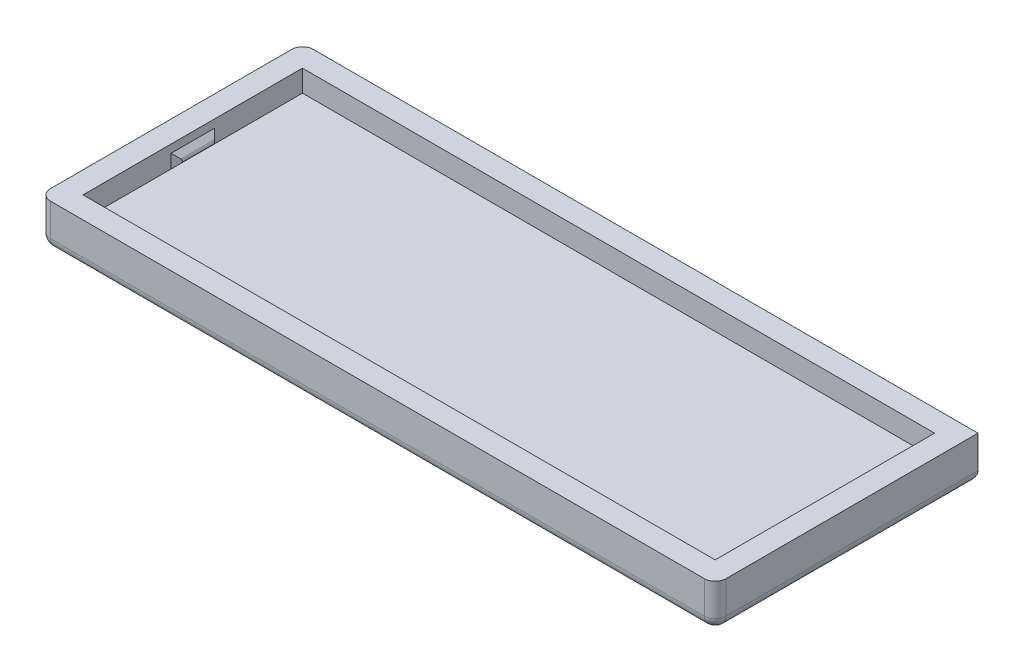
ISO-10303-21;
HEADER;
FILE_DESCRIPTION(('STEP AP214'),'2;1');
FILE_NAME('part.step','',(''),(''),'','','');
FILE_SCHEMA(('AUTOMOTIVE_DESIGN { 1 0 10303 214 1 1 1 1 }'));
ENDSEC;
DATA;
#1=APPLICATION_CONTEXT('core data for automotive mechanical design processes');
#2=APPLICATION_PROTOCOL_DEFINITION('international standard','automotive_design',2000,#1);
#3=PRODUCT_CONTEXT('',#1,'mechanical');
#4=PRODUCT('Part','Part','',(#3));
#5=PRODUCT_RELATED_PRODUCT_CATEGORY('part','',(#4));
#6=PRODUCT_DEFINITION_FORMATION('','',#4);
#7=PRODUCT_DEFINITION_CONTEXT('part definition',#1,'design');
#8=PRODUCT_DEFINITION('design','',#6,#7);
#9=PRODUCT_DEFINITION_SHAPE('','',#8);
#10=(LENGTH_UNIT() NAMED_UNIT(*) SI_UNIT(.MILLI.,.METRE.));
#11=(NAMED_UNIT(*) PLANE_ANGLE_UNIT() SI_UNIT($,.RADIAN.));
#12=(NAMED_UNIT(*) SI_UNIT($,.STERADIAN.) SOLID_ANGLE_UNIT());
#13=UNCERTAINTY_MEASURE_WITH_UNIT(LENGTH_MEASURE(1.E-05),#10,'distance_accuracy_value','');
#14=(GEOMETRIC_REPRESENTATION_CONTEXT(3) GLOBAL_UNCERTAINTY_ASSIGNED_CONTEXT((#13)) GLOBAL_UNIT_ASSIGNED_CONTEXT((#10,
#11,#12)) REPRESENTATION_CONTEXT('',''));
#15=CARTESIAN_POINT('',(0.,0.,0.));
#16=DIRECTION('',(0.,0.,1.));
#17=DIRECTION('',(1.,0.,0.));
#18=AXIS2_PLACEMENT_3D('',#15,#16,#17);
#19=CARTESIAN_POINT('',(-46.301,6.35,16.075));
#20=DIRECTION('',(1.,0.,0.));
#21=DIRECTION('',(0.,0.,-1.));
#22=AXIS2_PLACEMENT_3D('',#19,#20,#21);
#23=PLANE('',#22);
#24=DIRECTION('',(0.,0.,1.));
#25=VECTOR('',#24,1.);
#26=CARTESIAN_POINT('',(-46.301,3.175,16.075));
#27=LINE('',#26,#25);
#28=CARTESIAN_POINT('',(-46.301,3.175,3.175));
#29=VERTEX_POINT('',#28);
#30=CARTESIAN_POINT('',(-46.301,3.175,16.075));
#31=VERTEX_POINT('',#30);
#32=EDGE_CURVE('E283',#29,#31,#27,.T.);
#33=ORIENTED_EDGE('',*,*,#32,.F.);
#34=DIRECTION('',(0.,-1.,0.));
#35=VECTOR('',#34,1.);
#36=CARTESIAN_POINT('',(-46.301,3.175,3.175));
#37=LINE('',#36,#35);
#38=CARTESIAN_POINT('',(-46.301,5.175,3.175));
#39=VERTEX_POINT('',#38);
#40=EDGE_CURVE('E199',#39,#29,#37,.T.);
#41=ORIENTED_EDGE('',*,*,#40,.F.);
#42=DIRECTION('',(0.,0.,1.));
#43=VECTOR('',#42,1.);
#44=CARTESIAN_POINT('',(-46.301,5.175,3.175));
#45=LINE('',#44,#43);
#46=CARTESIAN_POINT('',(-46.301,5.175,-3.175));
#47=VERTEX_POINT('',#46);
#48=EDGE_CURVE('E244',#47,#39,#45,.T.);
#49=ORIENTED_EDGE('',*,*,#48,.F.);
#50=DIRECTION('',(0.,1.,0.));
#51=VECTOR('',#50,1.);
#52=CARTESIAN_POINT('',(-46.301,3.175,-3.175));
#53=LINE('',#52,#51);
#54=CARTESIAN_POINT('',(-46.301,3.175,-3.175));
#55=VERTEX_POINT('',#54);
#56=EDGE_CURVE('E240',#55,#47,#53,.T.);
#57=ORIENTED_EDGE('',*,*,#56,.F.);
#58=CARTESIAN_POINT('',(-46.301,3.175,-16.075));
#59=VERTEX_POINT('',#58);
#60=EDGE_CURVE('E284',#59,#55,#27,.T.);
#61=ORIENTED_EDGE('',*,*,#60,.F.);
#62=DIRECTION('',(0.,-1.,0.));
#63=VECTOR('',#62,1.);
#64=CARTESIAN_POINT('',(-46.301,6.35,-16.075));
#65=LINE('',#64,#63);
#66=CARTESIAN_POINT('',(-46.301,6.35,-16.075));
#67=VERTEX_POINT('',#66);
#68=EDGE_CURVE('E297',#67,#59,#65,.T.);
#69=ORIENTED_EDGE('',*,*,#68,.F.);
#70=DIRECTION('',(0.,0.,1.));
#71=VECTOR('',#70,1.);
#72=CARTESIAN_POINT('',(-46.301,6.35,16.075));
#73=LINE('',#72,#71);
#74=CARTESIAN_POINT('',(-46.301,6.35,16.075));
#75=VERTEX_POINT('',#74);
#76=EDGE_CURVE('E268',#67,#75,#73,.T.);
#77=ORIENTED_EDGE('',*,*,#76,.T.);
#78=DIRECTION('',(0.,-1.,0.));
#79=VECTOR('',#78,1.);
#80=CARTESIAN_POINT('',(-46.301,6.35,16.075));
#81=LINE('',#80,#79);
#82=EDGE_CURVE('E293',#75,#31,#81,.T.);
#83=ORIENTED_EDGE('',*,*,#82,.T.);
#84=EDGE_LOOP('',(#33,#41,#49,#57,#61,#69,#77,#83));
#85=FACE_BOUND('',#84,.T.);
#86=ADVANCED_FACE('F43',(#85),#23,.T.);
#87=CARTESIAN_POINT('',(49.476,3.175,19.25));
#88=DIRECTION('',(-1.,0.,0.));
#89=DIRECTION('',(0.,0.,1.));
#90=AXIS2_PLACEMENT_3D('',#87,#88,#89);
#91=PLANE('',#90);
#92=DIRECTION('',(0.,-1.,0.));
#93=VECTOR('',#92,1.);
#94=CARTESIAN_POINT('',(49.476,3.175,17.6625));
#95=LINE('',#94,#93);
#96=CARTESIAN_POINT('',(49.476,6.35,17.6625));
#97=VERTEX_POINT('',#96);
#98=CARTESIAN_POINT('',(49.476,1.5875,17.6625));
#99=VERTEX_POINT('',#98);
#100=EDGE_CURVE('E376',#97,#99,#95,.T.);
#101=ORIENTED_EDGE('',*,*,#100,.T.);
#102=DIRECTION('',(0.,0.,-1.));
#103=VECTOR('',#102,1.);
#104=CARTESIAN_POINT('',(49.476,1.5875,-19.25));
#105=LINE('',#104,#103);
#106=CARTESIAN_POINT('',(49.476,1.5875,-19.25));
#107=VERTEX_POINT('',#106);
#108=EDGE_CURVE('E379',#99,#107,#105,.T.);
#109=ORIENTED_EDGE('',*,*,#108,.T.);
#110=DIRECTION('',(0.,-1.,0.));
#111=VECTOR('',#110,1.);
#112=CARTESIAN_POINT('',(49.476,3.175,-19.25));
#113=LINE('',#112,#111);
#114=CARTESIAN_POINT('',(49.476,6.35,-19.25));
#115=VERTEX_POINT('',#114);
#116=EDGE_CURVE('E319',#115,#107,#113,.T.);
#117=ORIENTED_EDGE('',*,*,#116,.F.);
#118=DIRECTION('',(0.,0.,-1.));
#119=VECTOR('',#118,1.);
#120=CARTESIAN_POINT('',(49.476,6.35,19.25));
#121=LINE('',#120,#119);
#122=EDGE_CURVE('E308',#97,#115,#121,.T.);
#123=ORIENTED_EDGE('',*,*,#122,.F.);
#124=EDGE_LOOP('',(#101,#109,#117,#123));
#125=FACE_BOUND('',#124,.T.);
#126=ADVANCED_FACE('F452',(#125),#91,.F.);
#127=CARTESIAN_POINT('',(-49.476,3.175,-19.25));
#128=DIRECTION('',(0.,0.,1.));
#129=DIRECTION('',(1.,0.,0.));
#130=AXIS2_PLACEMENT_3D('',#127,#128,#129);
#131=PLANE('',#130);
#132=ORIENTED_EDGE('',*,*,#116,.T.);
#133=DIRECTION('',(-1.,0.,0.));
#134=VECTOR('',#133,1.);
#135=CARTESIAN_POINT('',(-49.476,1.5875,-19.25));
#136=LINE('',#135,#134);
#137=CARTESIAN_POINT('',(-47.8885,1.5875,-19.25));
#138=VERTEX_POINT('',#137);
#139=EDGE_CURVE('E373',#107,#138,#136,.T.);
#140=ORIENTED_EDGE('',*,*,#139,.T.);
#141=DIRECTION('',(0.,-1.,0.));
#142=VECTOR('',#141,1.);
#143=CARTESIAN_POINT('',(-47.8885,3.175,-19.25));
#144=LINE('',#143,#142);
#145=CARTESIAN_POINT('',(-47.8885,6.35,-19.25));
#146=VERTEX_POINT('',#145);
#147=EDGE_CURVE('E370',#138,#146,#144,.F.);
#148=ORIENTED_EDGE('',*,*,#147,.T.);
#149=DIRECTION('',(-1.,0.,0.));
#150=VECTOR('',#149,1.);
#151=CARTESIAN_POINT('',(49.476,6.35,-19.25));
#152=LINE('',#151,#150);
#153=EDGE_CURVE('E311',#115,#146,#152,.T.);
#154=ORIENTED_EDGE('',*,*,#153,.F.);
#155=EDGE_LOOP('',(#132,#140,#148,#154));
#156=FACE_BOUND('',#155,.T.);
#157=ADVANCED_FACE('F456',(#156),#131,.F.);
#158=CARTESIAN_POINT('',(-49.476,3.175,19.25));
#159=DIRECTION('',(1.,0.,0.));
#160=DIRECTION('',(0.,0.,-1.));
#161=AXIS2_PLACEMENT_3D('',#158,#159,#160);
#162=PLANE('',#161);
#163=DIRECTION('',(0.,0.,1.));
#164=VECTOR('',#163,1.);
#165=CARTESIAN_POINT('',(-49.476,1.5875,19.25));
#166=LINE('',#165,#164);
#167=CARTESIAN_POINT('',(-49.476,1.5875,-17.6625));
#168=VERTEX_POINT('',#167);
#169=CARTESIAN_POINT('',(-49.476,1.5875,17.6625));
#170=VERTEX_POINT('',#169);
#171=EDGE_CURVE('E350',#168,#170,#166,.T.);
#172=ORIENTED_EDGE('',*,*,#171,.T.);
#173=DIRECTION('',(0.,-1.,0.));
#174=VECTOR('',#173,1.);
#175=CARTESIAN_POINT('',(-49.476,3.175,17.6625));
#176=LINE('',#175,#174);
#177=CARTESIAN_POINT('',(-49.476,6.35,17.6625));
#178=VERTEX_POINT('',#177);
#179=EDGE_CURVE('E354',#170,#178,#176,.F.);
#180=ORIENTED_EDGE('',*,*,#179,.T.);
#181=DIRECTION('',(0.,0.,1.));
#182=VECTOR('',#181,1.);
#183=CARTESIAN_POINT('',(-49.476,6.35,-19.25));
#184=LINE('',#183,#182);
#185=CARTESIAN_POINT('',(-49.476,6.35,-17.6625));
#186=VERTEX_POINT('',#185);
#187=EDGE_CURVE('E315',#186,#178,#184,.T.);
#188=ORIENTED_EDGE('',*,*,#187,.F.);
#189=DIRECTION('',(0.,-1.,0.));
#190=VECTOR('',#189,1.);
#191=CARTESIAN_POINT('',(-49.476,3.175,-17.6625));
#192=LINE('',#191,#190);
#193=EDGE_CURVE('E347',#186,#168,#192,.T.);
#194=ORIENTED_EDGE('',*,*,#193,.T.);
#195=EDGE_LOOP('',(#172,#180,#188,#194));
#196=FACE_BOUND('',#195,.T.);
#197=ADVANCED_FACE('F470',(#196),#162,.F.);
#198=CARTESIAN_POINT('',(-49.476,3.175,19.25));
#199=DIRECTION('',(0.,0.,-1.));
#200=DIRECTION('',(-1.,0.,0.));
#201=AXIS2_PLACEMENT_3D('',#198,#199,#200);
#202=PLANE('',#201);
#203=DIRECTION('',(1.,0.,0.));
#204=VECTOR('',#203,1.);
#205=CARTESIAN_POINT('',(-49.476,6.35,19.25));
#206=LINE('',#205,#204);
#207=CARTESIAN_POINT('',(-47.8885,6.35,19.25));
#208=VERTEX_POINT('',#207);
#209=CARTESIAN_POINT('',(47.8885,6.35,19.25));
#210=VERTEX_POINT('',#209);
#211=EDGE_CURVE('E304',#208,#210,#206,.T.);
#212=ORIENTED_EDGE('',*,*,#211,.F.);
#213=DIRECTION('',(0.,-1.,0.));
#214=VECTOR('',#213,1.);
#215=CARTESIAN_POINT('',(-47.8885,3.175,19.25));
#216=LINE('',#215,#214);
#217=CARTESIAN_POINT('',(-47.8885,1.5875,19.25));
#218=VERTEX_POINT('',#217);
#219=EDGE_CURVE('E61',#208,#218,#216,.T.);
#220=ORIENTED_EDGE('',*,*,#219,.T.);
#221=DIRECTION('',(1.,0.,0.));
#222=VECTOR('',#221,1.);
#223=CARTESIAN_POINT('',(49.476,1.5875,19.25));
#224=LINE('',#223,#222);
#225=CARTESIAN_POINT('',(47.8885,1.5875,19.25));
#226=VERTEX_POINT('',#225);
#227=EDGE_CURVE('E65',#218,#226,#224,.T.);
#228=ORIENTED_EDGE('',*,*,#227,.T.);
#229=DIRECTION('',(0.,-1.,0.));
#230=VECTOR('',#229,1.);
#231=CARTESIAN_POINT('',(47.8885,3.175,19.25));
#232=LINE('',#231,#230);
#233=EDGE_CURVE('E382',#226,#210,#232,.F.);
#234=ORIENTED_EDGE('',*,*,#233,.T.);
#235=EDGE_LOOP('',(#212,#220,#228,#234));
#236=FACE_BOUND('',#235,.T.);
#237=ADVANCED_FACE('F520',(#236),#202,.F.);
#238=CARTESIAN_POINT('',(0.,0.,0.));
#239=DIRECTION('',(0.,-1.,0.));
#240=DIRECTION('',(0.,0.,-1.));
#241=AXIS2_PLACEMENT_3D('',#238,#239,#240);
#242=PLANE('',#241);
#243=DIRECTION('',(1.,0.,0.));
#244=VECTOR('',#243,1.);
#245=CARTESIAN_POINT('',(-49.476,0.,17.6625));
#246=LINE('',#245,#244);
#247=CARTESIAN_POINT('',(47.8885,0.,17.6625));
#248=VERTEX_POINT('',#247);
#249=CARTESIAN_POINT('',(-47.8885,0.,17.6625));
#250=VERTEX_POINT('',#249);
#251=EDGE_CURVE('E357',#248,#250,#246,.F.);
#252=ORIENTED_EDGE('',*,*,#251,.T.);
#253=DIRECTION('',(0.,0.,1.));
#254=VECTOR('',#253,1.);
#255=CARTESIAN_POINT('',(-47.8885,0.,-19.25));
#256=LINE('',#255,#254);
#257=CARTESIAN_POINT('',(-47.8885,0.,-17.6625));
#258=VERTEX_POINT('',#257);
#259=EDGE_CURVE('E366',#250,#258,#256,.F.);
#260=ORIENTED_EDGE('',*,*,#259,.T.);
#261=DIRECTION('',(-1.,0.,0.));
#262=VECTOR('',#261,1.);
#263=CARTESIAN_POINT('',(49.476,0.,-17.6625));
#264=LINE('',#263,#262);
#265=CARTESIAN_POINT('',(47.8885,0.,-17.6625));
#266=VERTEX_POINT('',#265);
#267=EDGE_CURVE('E363',#258,#266,#264,.F.);
#268=ORIENTED_EDGE('',*,*,#267,.T.);
#269=DIRECTION('',(0.,0.,-1.));
#270=VECTOR('',#269,1.);
#271=CARTESIAN_POINT('',(47.8885,0.,19.25));
#272=LINE('',#271,#270);
#273=EDGE_CURVE('E360',#266,#248,#272,.F.);
#274=ORIENTED_EDGE('',*,*,#273,.T.);
#275=EDGE_LOOP('',(#252,#260,#268,#274));
#276=FACE_BOUND('',#275,.T.);
#277=ADVANCED_FACE('F442',(#276),#242,.T.);
#278=CARTESIAN_POINT('',(0.,6.35,0.));
#279=DIRECTION('',(0.,1.,0.));
#280=DIRECTION('',(0.,0.,1.));
#281=AXIS2_PLACEMENT_3D('',#278,#279,#280);
#282=PLANE('',#281);
#283=ORIENTED_EDGE('',*,*,#187,.T.);
#284=CARTESIAN_POINT('',(-47.8885,6.35,17.6625));
#285=DIRECTION('',(0.,1.,0.));
#286=DIRECTION('',(0.,0.,1.));
#287=AXIS2_PLACEMENT_3D('',#284,#285,#286);
#288=CIRCLE('',#287,1.5875);
#289=EDGE_CURVE('E11',#178,#208,#288,.T.);
#290=ORIENTED_EDGE('',*,*,#289,.T.);
#291=ORIENTED_EDGE('',*,*,#211,.T.);
#292=CARTESIAN_POINT('',(47.8885,6.35,17.6625));
#293=DIRECTION('',(0.,1.,0.));
#294=DIRECTION('',(0.,0.,1.));
#295=AXIS2_PLACEMENT_3D('',#292,#293,#294);
#296=CIRCLE('',#295,1.5875);
#297=EDGE_CURVE('E389',#210,#97,#296,.T.);
#298=ORIENTED_EDGE('',*,*,#297,.T.);
#299=ORIENTED_EDGE('',*,*,#122,.T.);
#300=ORIENTED_EDGE('',*,*,#153,.T.);
#301=CARTESIAN_POINT('',(-47.8885,6.35,-17.6625));
#302=DIRECTION('',(0.,1.,0.));
#303=DIRECTION('',(0.,0.,1.));
#304=AXIS2_PLACEMENT_3D('',#301,#302,#303);
#305=CIRCLE('',#304,1.5875);
#306=EDGE_CURVE('E53',#146,#186,#305,.T.);
#307=ORIENTED_EDGE('',*,*,#306,.T.);
#308=EDGE_LOOP('',(#283,#290,#291,#298,#299,#300,#307));
#309=FACE_BOUND('',#308,.T.);
#310=DIRECTION('',(-1.,0.,0.));
#311=VECTOR('',#310,1.);
#312=CARTESIAN_POINT('',(-46.301,6.35,-16.075));
#313=LINE('',#312,#311);
#314=CARTESIAN_POINT('',(46.301,6.35,-16.075));
#315=VERTEX_POINT('',#314);
#316=EDGE_CURVE('E264',#315,#67,#313,.T.);
#317=ORIENTED_EDGE('',*,*,#316,.F.);
#318=DIRECTION('',(0.,0.,-1.));
#319=VECTOR('',#318,1.);
#320=CARTESIAN_POINT('',(46.301,6.35,16.075));
#321=LINE('',#320,#319);
#322=CARTESIAN_POINT('',(46.301,6.35,16.075));
#323=VERTEX_POINT('',#322);
#324=EDGE_CURVE('E261',#323,#315,#321,.T.);
#325=ORIENTED_EDGE('',*,*,#324,.F.);
#326=DIRECTION('',(1.,0.,0.));
#327=VECTOR('',#326,1.);
#328=CARTESIAN_POINT('',(-46.301,6.35,16.075));
#329=LINE('',#328,#327);
#330=EDGE_CURVE('E272',#75,#323,#329,.T.);
#331=ORIENTED_EDGE('',*,*,#330,.F.);
#332=ORIENTED_EDGE('',*,*,#76,.F.);
#333=EDGE_LOOP('',(#317,#325,#331,#332));
#334=FACE_BOUND('',#333,.T.);
#335=ADVANCED_FACE('F460',(#309,#334),#282,.T.);
#336=CARTESIAN_POINT('',(46.301,6.35,16.075));
#337=DIRECTION('',(-1.,0.,0.));
#338=DIRECTION('',(0.,0.,1.));
#339=AXIS2_PLACEMENT_3D('',#336,#337,#338);
#340=PLANE('',#339);
#341=DIRECTION('',(0.,-1.,0.));
#342=VECTOR('',#341,1.);
#343=CARTESIAN_POINT('',(46.301,3.175,3.175));
#344=LINE('',#343,#342);
#345=CARTESIAN_POINT('',(46.301,5.175,3.175));
#346=VERTEX_POINT('',#345);
#347=CARTESIAN_POINT('',(46.301,3.175,3.175));
#348=VERTEX_POINT('',#347);
#349=EDGE_CURVE('E203',#346,#348,#344,.T.);
#350=ORIENTED_EDGE('',*,*,#349,.T.);
#351=DIRECTION('',(0.,0.,-1.));
#352=VECTOR('',#351,1.);
#353=CARTESIAN_POINT('',(46.301,3.175,16.075));
#354=LINE('',#353,#352);
#355=CARTESIAN_POINT('',(46.301,3.175,16.075));
#356=VERTEX_POINT('',#355);
#357=EDGE_CURVE('E276',#356,#348,#354,.T.);
#358=ORIENTED_EDGE('',*,*,#357,.F.);
#359=DIRECTION('',(0.,-1.,0.));
#360=VECTOR('',#359,1.);
#361=CARTESIAN_POINT('',(46.301,6.35,16.075));
#362=LINE('',#361,#360);
#363=EDGE_CURVE('E275',#323,#356,#362,.T.);
#364=ORIENTED_EDGE('',*,*,#363,.F.);
#365=ORIENTED_EDGE('',*,*,#324,.T.);
#366=DIRECTION('',(0.,-1.,0.));
#367=VECTOR('',#366,1.);
#368=CARTESIAN_POINT('',(46.301,6.35,-16.075));
#369=LINE('',#368,#367);
#370=CARTESIAN_POINT('',(46.301,3.175,-16.075));
#371=VERTEX_POINT('',#370);
#372=EDGE_CURVE('E300',#315,#371,#369,.T.);
#373=ORIENTED_EDGE('',*,*,#372,.T.);
#374=CARTESIAN_POINT('',(46.301,3.175,-3.175));
#375=VERTEX_POINT('',#374);
#376=EDGE_CURVE('E252',#375,#371,#354,.T.);
#377=ORIENTED_EDGE('',*,*,#376,.F.);
#378=DIRECTION('',(0.,1.,0.));
#379=VECTOR('',#378,1.);
#380=CARTESIAN_POINT('',(46.301,3.175,-3.175));
#381=LINE('',#380,#379);
#382=CARTESIAN_POINT('',(46.301,5.175,-3.175));
#383=VERTEX_POINT('',#382);
#384=EDGE_CURVE('E216',#375,#383,#381,.T.);
#385=ORIENTED_EDGE('',*,*,#384,.T.);
#386=DIRECTION('',(0.,0.,1.));
#387=VECTOR('',#386,1.);
#388=CARTESIAN_POINT('',(46.301,5.175,3.175));
#389=LINE('',#388,#387);
#390=EDGE_CURVE('E193',#383,#346,#389,.T.);
#391=ORIENTED_EDGE('',*,*,#390,.T.);
#392=EDGE_LOOP('',(#350,#358,#364,#365,#373,#377,#385,#391));
#393=FACE_BOUND('',#392,.T.);
#394=ADVANCED_FACE('F213',(#393),#340,.T.);
#395=CARTESIAN_POINT('',(-46.301,6.35,-16.075));
#396=DIRECTION('',(0.,0.,1.));
#397=DIRECTION('',(1.,0.,0.));
#398=AXIS2_PLACEMENT_3D('',#395,#396,#397);
#399=PLANE('',#398);
#400=DIRECTION('',(-1.,0.,0.));
#401=VECTOR('',#400,1.);
#402=CARTESIAN_POINT('',(-46.301,3.175,-16.075));
#403=LINE('',#402,#401);
#404=EDGE_CURVE('E279',#371,#59,#403,.T.);
#405=ORIENTED_EDGE('',*,*,#404,.F.);
#406=ORIENTED_EDGE('',*,*,#372,.F.);
#407=ORIENTED_EDGE('',*,*,#316,.T.);
#408=ORIENTED_EDGE('',*,*,#68,.T.);
#409=EDGE_LOOP('',(#405,#406,#407,#408));
#410=FACE_BOUND('',#409,.T.);
#411=ADVANCED_FACE('F505',(#410),#399,.T.);
#412=CARTESIAN_POINT('',(-46.301,6.35,16.075));
#413=DIRECTION('',(0.,0.,-1.));
#414=DIRECTION('',(-1.,0.,0.));
#415=AXIS2_PLACEMENT_3D('',#412,#413,#414);
#416=PLANE('',#415);
#417=DIRECTION('',(1.,0.,0.));
#418=VECTOR('',#417,1.);
#419=CARTESIAN_POINT('',(-46.301,3.175,16.075));
#420=LINE('',#419,#418);
#421=EDGE_CURVE('E265',#31,#356,#420,.T.);
#422=ORIENTED_EDGE('',*,*,#421,.F.);
#423=ORIENTED_EDGE('',*,*,#82,.F.);
#424=ORIENTED_EDGE('',*,*,#330,.T.);
#425=ORIENTED_EDGE('',*,*,#363,.T.);
#426=EDGE_LOOP('',(#422,#423,#424,#425));
#427=FACE_BOUND('',#426,.T.);
#428=ADVANCED_FACE('F503',(#427),#416,.T.);
#429=CARTESIAN_POINT('',(0.,3.175,0.));
#430=DIRECTION('',(0.,-1.,0.));
#431=DIRECTION('',(0.,0.,-1.));
#432=AXIS2_PLACEMENT_3D('',#429,#430,#431);
#433=PLANE('',#432);
#434=ORIENTED_EDGE('',*,*,#421,.T.);
#435=ORIENTED_EDGE('',*,*,#357,.T.);
#436=DIRECTION('',(0.,0.,-1.));
#437=VECTOR('',#436,1.);
#438=CARTESIAN_POINT('',(46.301,3.175,3.175));
#439=LINE('',#438,#437);
#440=EDGE_CURVE('E220',#348,#375,#439,.T.);
#441=ORIENTED_EDGE('',*,*,#440,.T.);
#442=ORIENTED_EDGE('',*,*,#376,.T.);
#443=ORIENTED_EDGE('',*,*,#404,.T.);
#444=ORIENTED_EDGE('',*,*,#60,.T.);
#445=DIRECTION('',(0.,0.,-1.));
#446=VECTOR('',#445,1.);
#447=CARTESIAN_POINT('',(-46.301,3.175,3.175));
#448=LINE('',#447,#446);
#449=EDGE_CURVE('E236',#29,#55,#448,.T.);
#450=ORIENTED_EDGE('',*,*,#449,.F.);
#451=ORIENTED_EDGE('',*,*,#32,.T.);
#452=EDGE_LOOP('',(#434,#435,#441,#442,#443,#444,#450,#451));
#453=FACE_BOUND('',#452,.T.);
#454=ADVANCED_FACE('F513',(#453),#433,.F.);
#455=CARTESIAN_POINT('',(-46.301,3.175,3.175));
#456=DIRECTION('',(0.707106781186549,0.,0.707106781186546));
#457=DIRECTION('',(0.707106781186546,0.,-0.707106781186549));
#458=AXIS2_PLACEMENT_3D('',#455,#456,#457);
#459=PLANE('',#458);
#460=DIRECTION('',(-0.577350269189625,-0.577350269189627,0.577350269189626));
#461=VECTOR('',#460,1.);
#462=CARTESIAN_POINT('',(-46.301,3.175,3.175));
#463=LINE('',#462,#461);
#464=CARTESIAN_POINT('',(-45.5816330037834,3.89436699621659,2.45563300378341));
#465=VERTEX_POINT('',#464);
#466=EDGE_CURVE('E249',#465,#29,#463,.T.);
#467=ORIENTED_EDGE('',*,*,#466,.F.);
#468=CARTESIAN_POINT('',(-45.8622660075668,4.175,2.73626600756683));
#469=DIRECTION('',(0.707106781186549,0.,0.707106781186546));
#470=DIRECTION('',(-0.707106781186546,0.,0.707106781186549));
#471=AXIS2_PLACEMENT_3D('',#468,#469,#470);
#472=ELLIPSE('',#471,0.561266007566823,0.396875);
#473=CARTESIAN_POINT('',(-45.5816330037834,4.45563300378341,2.45563300378341));
#474=VERTEX_POINT('',#473);
#475=EDGE_CURVE('E327',#465,#474,#472,.T.);
#476=ORIENTED_EDGE('',*,*,#475,.T.);
#477=DIRECTION('',(-0.577350269189624,0.577350269189626,0.577350269189627));
#478=VECTOR('',#477,1.);
#479=CARTESIAN_POINT('',(-45.6343333333333,4.50833333333333,2.50833333333333));
#480=LINE('',#479,#478);
#481=EDGE_CURVE('E248',#474,#39,#480,.T.);
#482=ORIENTED_EDGE('',*,*,#481,.T.);
#483=ORIENTED_EDGE('',*,*,#40,.T.);
#484=EDGE_LOOP('',(#467,#476,#482,#483));
#485=FACE_BOUND('',#484,.T.);
#486=ADVANCED_FACE('F516',(#485),#459,.T.);
#487=CARTESIAN_POINT('',(-46.301,3.175,3.175));
#488=DIRECTION('',(0.707106781186549,-0.707106781186546,0.));
#489=DIRECTION('',(0.707106781186546,0.707106781186549,0.));
#490=AXIS2_PLACEMENT_3D('',#487,#488,#489);
#491=PLANE('',#490);
#492=DIRECTION('',(-0.577350269189624,-0.577350269189627,-0.577350269189627));
#493=VECTOR('',#492,1.);
#494=CARTESIAN_POINT('',(-46.301,3.175,-3.175));
#495=LINE('',#494,#493);
#496=CARTESIAN_POINT('',(-45.5816330037834,3.89436699621659,-2.45563300378341));
#497=VERTEX_POINT('',#496);
#498=EDGE_CURVE('E253',#497,#55,#495,.T.);
#499=ORIENTED_EDGE('',*,*,#498,.F.);
#500=DIRECTION('',(0.,0.,-1.));
#501=VECTOR('',#500,1.);
#502=CARTESIAN_POINT('',(-45.5816330037834,3.89436699621659,3.175));
#503=LINE('',#502,#501);
#504=EDGE_CURVE('E323',#497,#465,#503,.F.);
#505=ORIENTED_EDGE('',*,*,#504,.T.);
#506=ORIENTED_EDGE('',*,*,#466,.T.);
#507=ORIENTED_EDGE('',*,*,#449,.T.);
#508=EDGE_LOOP('',(#499,#505,#506,#507));
#509=FACE_BOUND('',#508,.T.);
#510=ADVANCED_FACE('F698',(#509),#491,.T.);
#511=CARTESIAN_POINT('',(-46.301,3.175,-3.175));
#512=DIRECTION('',(0.707106781186549,0.,-0.707106781186546));
#513=DIRECTION('',(-0.707106781186546,0.,-0.707106781186549));
#514=AXIS2_PLACEMENT_3D('',#511,#512,#513);
#515=PLANE('',#514);
#516=DIRECTION('',(-0.577350269189624,0.577350269189627,-0.577350269189627));
#517=VECTOR('',#516,1.);
#518=CARTESIAN_POINT('',(-44.1843333333333,3.05833333333333,-1.05833333333333));
#519=LINE('',#518,#517);
#520=CARTESIAN_POINT('',(-45.5816330037834,4.45563300378341,-2.45563300378341));
#521=VERTEX_POINT('',#520);
#522=EDGE_CURVE('E256',#521,#47,#519,.T.);
#523=ORIENTED_EDGE('',*,*,#522,.F.);
#524=CARTESIAN_POINT('',(-45.8622660075668,4.175,-2.73626600756682));
#525=DIRECTION('',(0.707106781186549,0.,-0.707106781186546));
#526=DIRECTION('',(0.707106781186546,0.,0.707106781186549));
#527=AXIS2_PLACEMENT_3D('',#524,#525,#526);
#528=ELLIPSE('',#527,0.561266007566823,0.396875);
#529=EDGE_CURVE('E333',#521,#497,#528,.T.);
#530=ORIENTED_EDGE('',*,*,#529,.T.);
#531=ORIENTED_EDGE('',*,*,#498,.T.);
#532=ORIENTED_EDGE('',*,*,#56,.T.);
#533=EDGE_LOOP('',(#523,#530,#531,#532));
#534=FACE_BOUND('',#533,.T.);
#535=ADVANCED_FACE('F687',(#534),#515,.T.);
#536=CARTESIAN_POINT('',(-46.301,5.175,3.175));
#537=DIRECTION('',(0.707106781186549,0.707106781186546,0.));
#538=DIRECTION('',(-0.707106781186546,0.707106781186549,0.));
#539=AXIS2_PLACEMENT_3D('',#536,#537,#538);
#540=PLANE('',#539);
#541=ORIENTED_EDGE('',*,*,#481,.F.);
#542=DIRECTION('',(0.,0.,-1.));
#543=VECTOR('',#542,1.);
#544=CARTESIAN_POINT('',(-45.5816330037834,4.45563300378341,3.175));
#545=LINE('',#544,#543);
#546=EDGE_CURVE('E330',#474,#521,#545,.T.);
#547=ORIENTED_EDGE('',*,*,#546,.T.);
#548=ORIENTED_EDGE('',*,*,#522,.T.);
#549=ORIENTED_EDGE('',*,*,#48,.T.);
#550=EDGE_LOOP('',(#541,#547,#548,#549));
#551=FACE_BOUND('',#550,.T.);
#552=ADVANCED_FACE('F530',(#551),#540,.T.);
#553=CARTESIAN_POINT('',(-45.8622660075668,4.175,3.175));
#554=DIRECTION('',(0.,0.,1.));
#555=DIRECTION('',(1.,0.,0.));
#556=AXIS2_PLACEMENT_3D('',#553,#554,#555);
#557=CYLINDRICAL_SURFACE('',#556,0.396875);
#558=ORIENTED_EDGE('',*,*,#529,.F.);
#559=ORIENTED_EDGE('',*,*,#546,.F.);
#560=ORIENTED_EDGE('',*,*,#475,.F.);
#561=ORIENTED_EDGE('',*,*,#504,.F.);
#562=EDGE_LOOP('',(#558,#559,#560,#561));
#563=FACE_BOUND('',#562,.T.);
#564=ADVANCED_FACE('F527',(#563),#557,.T.);
#565=CARTESIAN_POINT('',(46.301,3.175,3.175));
#566=DIRECTION('',(-0.707106781186549,0.,0.707106781186546));
#567=DIRECTION('',(0.707106781186546,0.,0.707106781186549));
#568=AXIS2_PLACEMENT_3D('',#565,#566,#567);
#569=PLANE('',#568);
#570=DIRECTION('',(0.577350269189624,0.577350269189626,0.577350269189627));
#571=VECTOR('',#570,1.);
#572=CARTESIAN_POINT('',(46.301,5.175,3.175));
#573=LINE('',#572,#571);
#574=CARTESIAN_POINT('',(45.5816330037834,4.45563300378341,2.45563300378341));
#575=VERTEX_POINT('',#574);
#576=EDGE_CURVE('E188',#575,#346,#573,.T.);
#577=ORIENTED_EDGE('',*,*,#576,.F.);
#578=CARTESIAN_POINT('',(45.8622660075668,4.175,2.73626600756683));
#579=DIRECTION('',(-0.707106781186549,0.,0.707106781186546));
#580=DIRECTION('',(0.707106781186546,0.,0.707106781186549));
#581=AXIS2_PLACEMENT_3D('',#578,#579,#580);
#582=ELLIPSE('',#581,0.561266007566823,0.396875);
#583=CARTESIAN_POINT('',(45.5816330037834,3.89436699621659,2.45563300378341));
#584=VERTEX_POINT('',#583);
#585=EDGE_CURVE('E338',#575,#584,#582,.T.);
#586=ORIENTED_EDGE('',*,*,#585,.T.);
#587=DIRECTION('',(0.577350269189625,-0.577350269189627,0.577350269189626));
#588=VECTOR('',#587,1.);
#589=CARTESIAN_POINT('',(46.301,3.175,3.175));
#590=LINE('',#589,#588);
#591=EDGE_CURVE('E206',#584,#348,#590,.T.);
#592=ORIENTED_EDGE('',*,*,#591,.T.);
#593=ORIENTED_EDGE('',*,*,#349,.F.);
#594=EDGE_LOOP('',(#577,#586,#592,#593));
#595=FACE_BOUND('',#594,.T.);
#596=ADVANCED_FACE('F204',(#595),#569,.T.);
#597=CARTESIAN_POINT('',(46.301,5.175,3.175));
#598=DIRECTION('',(-0.707106781186549,0.707106781186546,0.));
#599=DIRECTION('',(-0.707106781186546,-0.707106781186549,0.));
#600=AXIS2_PLACEMENT_3D('',#597,#598,#599);
#601=PLANE('',#600);
#602=DIRECTION('',(0.577350269189624,0.577350269189627,-0.577350269189627));
#603=VECTOR('',#602,1.);
#604=CARTESIAN_POINT('',(45.6343333333333,4.50833333333333,-2.50833333333333));
#605=LINE('',#604,#603);
#606=CARTESIAN_POINT('',(45.5816330037834,4.45563300378341,-2.45563300378341));
#607=VERTEX_POINT('',#606);
#608=EDGE_CURVE('E200',#607,#383,#605,.T.);
#609=ORIENTED_EDGE('',*,*,#608,.F.);
#610=DIRECTION('',(0.,0.,1.));
#611=VECTOR('',#610,1.);
#612=CARTESIAN_POINT('',(45.5816330037834,4.45563300378341,3.175));
#613=LINE('',#612,#611);
#614=EDGE_CURVE('E196',#607,#575,#613,.T.);
#615=ORIENTED_EDGE('',*,*,#614,.T.);
#616=ORIENTED_EDGE('',*,*,#576,.T.);
#617=ORIENTED_EDGE('',*,*,#390,.F.);
#618=EDGE_LOOP('',(#609,#615,#616,#617));
#619=FACE_BOUND('',#618,.T.);
#620=ADVANCED_FACE('F191',(#619),#601,.T.);
#621=CARTESIAN_POINT('',(46.301,3.175,-3.175));
#622=DIRECTION('',(-0.707106781186549,0.,-0.707106781186546));
#623=DIRECTION('',(-0.707106781186546,0.,0.707106781186549));
#624=AXIS2_PLACEMENT_3D('',#621,#622,#623);
#625=PLANE('',#624);
#626=DIRECTION('',(0.577350269189624,-0.577350269189627,-0.577350269189627));
#627=VECTOR('',#626,1.);
#628=CARTESIAN_POINT('',(44.1843333333333,5.29166666666667,-1.05833333333333));
#629=LINE('',#628,#627);
#630=CARTESIAN_POINT('',(45.5816330037834,3.89436699621659,-2.45563300378341));
#631=VERTEX_POINT('',#630);
#632=EDGE_CURVE('E228',#631,#375,#629,.T.);
#633=ORIENTED_EDGE('',*,*,#632,.F.);
#634=CARTESIAN_POINT('',(45.8622660075668,4.175,-2.73626600756682));
#635=DIRECTION('',(-0.707106781186549,0.,-0.707106781186546));
#636=DIRECTION('',(-0.707106781186546,0.,0.707106781186549));
#637=AXIS2_PLACEMENT_3D('',#634,#635,#636);
#638=ELLIPSE('',#637,0.561266007566823,0.396875);
#639=EDGE_CURVE('E344',#631,#607,#638,.T.);
#640=ORIENTED_EDGE('',*,*,#639,.T.);
#641=ORIENTED_EDGE('',*,*,#608,.T.);
#642=ORIENTED_EDGE('',*,*,#384,.F.);
#643=EDGE_LOOP('',(#633,#640,#641,#642));
#644=FACE_BOUND('',#643,.T.);
#645=ADVANCED_FACE('F639',(#644),#625,.T.);
#646=CARTESIAN_POINT('',(46.301,3.175,3.175));
#647=DIRECTION('',(-0.707106781186549,-0.707106781186546,0.));
#648=DIRECTION('',(0.707106781186546,-0.707106781186549,0.));
#649=AXIS2_PLACEMENT_3D('',#646,#647,#648);
#650=PLANE('',#649);
#651=ORIENTED_EDGE('',*,*,#591,.F.);
#652=DIRECTION('',(0.,0.,1.));
#653=VECTOR('',#652,1.);
#654=CARTESIAN_POINT('',(45.5816330037834,3.89436699621659,3.175));
#655=LINE('',#654,#653);
#656=EDGE_CURVE('E341',#584,#631,#655,.F.);
#657=ORIENTED_EDGE('',*,*,#656,.T.);
#658=ORIENTED_EDGE('',*,*,#632,.T.);
#659=ORIENTED_EDGE('',*,*,#440,.F.);
#660=EDGE_LOOP('',(#651,#657,#658,#659));
#661=FACE_BOUND('',#660,.T.);
#662=ADVANCED_FACE('F535',(#661),#650,.T.);
#663=CARTESIAN_POINT('',(45.8622660075668,4.175,3.175));
#664=DIRECTION('',(0.,0.,1.));
#665=DIRECTION('',(1.,0.,0.));
#666=AXIS2_PLACEMENT_3D('',#663,#664,#665);
#667=CYLINDRICAL_SURFACE('',#666,0.396875);
#668=ORIENTED_EDGE('',*,*,#639,.F.);
#669=ORIENTED_EDGE('',*,*,#656,.F.);
#670=ORIENTED_EDGE('',*,*,#585,.F.);
#671=ORIENTED_EDGE('',*,*,#614,.F.);
#672=EDGE_LOOP('',(#668,#669,#670,#671));
#673=FACE_BOUND('',#672,.T.);
#674=ADVANCED_FACE('F532',(#673),#667,.T.);
#675=CARTESIAN_POINT('',(47.8885,3.175,17.6625));
#676=DIRECTION('',(0.,-1.,0.));
#677=DIRECTION('',(0.,0.,-1.));
#678=AXIS2_PLACEMENT_3D('',#675,#676,#677);
#679=CYLINDRICAL_SURFACE('',#678,1.5875);
#680=ORIENTED_EDGE('',*,*,#297,.F.);
#681=ORIENTED_EDGE('',*,*,#233,.F.);
#682=CARTESIAN_POINT('',(47.8885,1.5875,17.6625));
#683=DIRECTION('',(0.,-1.,0.));
#684=DIRECTION('',(0.,0.,-1.));
#685=AXIS2_PLACEMENT_3D('',#682,#683,#684);
#686=CIRCLE('',#685,1.5875);
#687=EDGE_CURVE('E47',#99,#226,#686,.T.);
#688=ORIENTED_EDGE('',*,*,#687,.F.);
#689=ORIENTED_EDGE('',*,*,#100,.F.);
#690=EDGE_LOOP('',(#680,#681,#688,#689));
#691=FACE_BOUND('',#690,.T.);
#692=ADVANCED_FACE('F45',(#691),#679,.T.);
#693=CARTESIAN_POINT('',(47.8885,1.5875,19.25));
#694=DIRECTION('',(0.,0.,1.));
#695=DIRECTION('',(1.,0.,0.));
#696=AXIS2_PLACEMENT_3D('',#693,#694,#695);
#697=CYLINDRICAL_SURFACE('',#696,1.5875);
#698=CARTESIAN_POINT('',(47.8885,1.5875,-17.6625));
#699=DIRECTION('',(0.707106781186547,0.,0.707106781186547));
#700=DIRECTION('',(-0.707106781186547,0.,0.707106781186547));
#701=AXIS2_PLACEMENT_3D('',#698,#699,#700);
#702=ELLIPSE('',#701,2.24506403026729,1.5875);
#703=EDGE_CURVE('E420',#107,#266,#702,.F.);
#704=ORIENTED_EDGE('',*,*,#703,.F.);
#705=ORIENTED_EDGE('',*,*,#108,.F.);
#706=CARTESIAN_POINT('',(47.8885,1.5875,17.6625));
#707=DIRECTION('',(0.,0.,1.));
#708=DIRECTION('',(1.,0.,0.));
#709=AXIS2_PLACEMENT_3D('',#706,#707,#708);
#710=CIRCLE('',#709,1.5875);
#711=EDGE_CURVE('E423',#248,#99,#710,.T.);
#712=ORIENTED_EDGE('',*,*,#711,.F.);
#713=ORIENTED_EDGE('',*,*,#273,.F.);
#714=EDGE_LOOP('',(#704,#705,#712,#713));
#715=FACE_BOUND('',#714,.T.);
#716=ADVANCED_FACE('F448',(#715),#697,.T.);
#717=CARTESIAN_POINT('',(47.8885,1.5875,17.6625));
#718=DIRECTION('',(1.,0.,0.));
#719=DIRECTION('',(0.,0.,-1.));
#720=AXIS2_PLACEMENT_3D('',#717,#718,#719);
#721=SPHERICAL_SURFACE('',#720,1.5875);
#722=ORIENTED_EDGE('',*,*,#711,.T.);
#723=ORIENTED_EDGE('',*,*,#687,.T.);
#724=CARTESIAN_POINT('',(47.8885,1.5875,17.6625));
#725=DIRECTION('',(1.,0.,0.));
#726=DIRECTION('',(0.,0.,-1.));
#727=AXIS2_PLACEMENT_3D('',#724,#725,#726);
#728=CIRCLE('',#727,1.5875);
#729=EDGE_CURVE('E416',#248,#226,#728,.F.);
#730=ORIENTED_EDGE('',*,*,#729,.F.);
#731=EDGE_LOOP('',(#722,#723,#730));
#732=FACE_BOUND('',#731,.T.);
#733=ADVANCED_FACE('F432',(#732),#721,.T.);
#734=CARTESIAN_POINT('',(-49.476,1.5875,-17.6625));
#735=DIRECTION('',(1.,0.,0.));
#736=DIRECTION('',(0.,0.,-1.));
#737=AXIS2_PLACEMENT_3D('',#734,#735,#736);
#738=CYLINDRICAL_SURFACE('',#737,1.5875);
#739=ORIENTED_EDGE('',*,*,#703,.T.);
#740=ORIENTED_EDGE('',*,*,#267,.F.);
#741=CARTESIAN_POINT('',(-47.8885,1.5875,-17.6625));
#742=DIRECTION('',(-1.,0.,0.));
#743=DIRECTION('',(0.,0.,1.));
#744=AXIS2_PLACEMENT_3D('',#741,#742,#743);
#745=CIRCLE('',#744,1.5875);
#746=EDGE_CURVE('E412',#138,#258,#745,.T.);
#747=ORIENTED_EDGE('',*,*,#746,.F.);
#748=ORIENTED_EDGE('',*,*,#139,.F.);
#749=EDGE_LOOP('',(#739,#740,#747,#748));
#750=FACE_BOUND('',#749,.T.);
#751=ADVANCED_FACE('F484',(#750),#738,.T.);
#752=CARTESIAN_POINT('',(-47.8885,3.175,-17.6625));
#753=DIRECTION('',(0.,-1.,0.));
#754=DIRECTION('',(0.,0.,-1.));
#755=AXIS2_PLACEMENT_3D('',#752,#753,#754);
#756=CYLINDRICAL_SURFACE('',#755,1.5875);
#757=ORIENTED_EDGE('',*,*,#306,.F.);
#758=ORIENTED_EDGE('',*,*,#147,.F.);
#759=CARTESIAN_POINT('',(-47.8885,1.5875,-17.6625));
#760=DIRECTION('',(0.,-1.,0.));
#761=DIRECTION('',(0.,0.,-1.));
#762=AXIS2_PLACEMENT_3D('',#759,#760,#761);
#763=CIRCLE('',#762,1.5875);
#764=EDGE_CURVE('E408',#168,#138,#763,.T.);
#765=ORIENTED_EDGE('',*,*,#764,.F.);
#766=ORIENTED_EDGE('',*,*,#193,.F.);
#767=EDGE_LOOP('',(#757,#758,#765,#766));
#768=FACE_BOUND('',#767,.T.);
#769=ADVANCED_FACE('F465',(#768),#756,.T.);
#770=CARTESIAN_POINT('',(-47.8885,3.175,17.6625));
#771=DIRECTION('',(0.,-1.,0.));
#772=DIRECTION('',(0.,0.,-1.));
#773=AXIS2_PLACEMENT_3D('',#770,#771,#772);
#774=CYLINDRICAL_SURFACE('',#773,1.5875);
#775=ORIENTED_EDGE('',*,*,#289,.F.);
#776=ORIENTED_EDGE('',*,*,#179,.F.);
#777=CARTESIAN_POINT('',(-47.8885,1.5875,17.6625));
#778=DIRECTION('',(0.,-1.,0.));
#779=DIRECTION('',(0.,0.,-1.));
#780=AXIS2_PLACEMENT_3D('',#777,#778,#779);
#781=CIRCLE('',#780,1.5875);
#782=EDGE_CURVE('E404',#218,#170,#781,.T.);
#783=ORIENTED_EDGE('',*,*,#782,.F.);
#784=ORIENTED_EDGE('',*,*,#219,.F.);
#785=EDGE_LOOP('',(#775,#776,#783,#784));
#786=FACE_BOUND('',#785,.T.);
#787=ADVANCED_FACE('F475',(#786),#774,.T.);
#788=CARTESIAN_POINT('',(-49.476,1.5875,17.6625));
#789=DIRECTION('',(-1.,0.,0.));
#790=DIRECTION('',(0.,0.,1.));
#791=AXIS2_PLACEMENT_3D('',#788,#789,#790);
#792=CYLINDRICAL_SURFACE('',#791,1.5875);
#793=ORIENTED_EDGE('',*,*,#729,.T.);
#794=ORIENTED_EDGE('',*,*,#227,.F.);
#795=CARTESIAN_POINT('',(-47.8885,1.5875,17.6625));
#796=DIRECTION('',(-1.,0.,0.));
#797=DIRECTION('',(0.,0.,1.));
#798=AXIS2_PLACEMENT_3D('',#795,#796,#797);
#799=CIRCLE('',#798,1.5875);
#800=EDGE_CURVE('E400',#250,#218,#799,.T.);
#801=ORIENTED_EDGE('',*,*,#800,.F.);
#802=ORIENTED_EDGE('',*,*,#251,.F.);
#803=EDGE_LOOP('',(#793,#794,#801,#802));
#804=FACE_BOUND('',#803,.T.);
#805=ADVANCED_FACE('F437',(#804),#792,.T.);
#806=CARTESIAN_POINT('',(-47.8885,1.5875,-17.6625));
#807=DIRECTION('',(0.,0.,-1.));
#808=DIRECTION('',(-1.,0.,0.));
#809=AXIS2_PLACEMENT_3D('',#806,#807,#808);
#810=SPHERICAL_SURFACE('',#809,1.5875);
#811=ORIENTED_EDGE('',*,*,#764,.T.);
#812=ORIENTED_EDGE('',*,*,#746,.T.);
#813=CARTESIAN_POINT('',(-47.8885,1.5875,-17.6625));
#814=DIRECTION('',(0.,0.,-1.));
#815=DIRECTION('',(-1.,0.,0.));
#816=AXIS2_PLACEMENT_3D('',#813,#814,#815);
#817=CIRCLE('',#816,1.5875);
#818=EDGE_CURVE('E397',#168,#258,#817,.F.);
#819=ORIENTED_EDGE('',*,*,#818,.F.);
#820=EDGE_LOOP('',(#811,#812,#819));
#821=FACE_BOUND('',#820,.T.);
#822=ADVANCED_FACE('F482',(#821),#810,.T.);
#823=CARTESIAN_POINT('',(-47.8885,1.5875,17.6625));
#824=DIRECTION('',(0.,0.,1.));
#825=DIRECTION('',(1.,0.,0.));
#826=AXIS2_PLACEMENT_3D('',#823,#824,#825);
#827=SPHERICAL_SURFACE('',#826,1.5875);
#828=ORIENTED_EDGE('',*,*,#800,.T.);
#829=ORIENTED_EDGE('',*,*,#782,.T.);
#830=CARTESIAN_POINT('',(-47.8885,1.5875,17.6625));
#831=DIRECTION('',(0.,0.,1.));
#832=DIRECTION('',(1.,0.,0.));
#833=AXIS2_PLACEMENT_3D('',#830,#831,#832);
#834=CIRCLE('',#833,1.5875);
#835=EDGE_CURVE('E394',#250,#170,#834,.F.);
#836=ORIENTED_EDGE('',*,*,#835,.F.);
#837=EDGE_LOOP('',(#828,#829,#836));
#838=FACE_BOUND('',#837,.T.);
#839=ADVANCED_FACE('F478',(#838),#827,.T.);
#840=CARTESIAN_POINT('',(-47.8885,1.5875,19.25));
#841=DIRECTION('',(0.,0.,-1.));
#842=DIRECTION('',(-1.,0.,0.));
#843=AXIS2_PLACEMENT_3D('',#840,#841,#842);
#844=CYLINDRICAL_SURFACE('',#843,1.5875);
#845=ORIENTED_EDGE('',*,*,#818,.T.);
#846=ORIENTED_EDGE('',*,*,#259,.F.);
#847=ORIENTED_EDGE('',*,*,#835,.T.);
#848=ORIENTED_EDGE('',*,*,#171,.F.);
#849=EDGE_LOOP('',(#845,#846,#847,#848));
#850=FACE_BOUND('',#849,.T.);
#851=ADVANCED_FACE('F480',(#850),#844,.T.);
#852=CLOSED_SHELL('',(#86,#126,#157,#197,#237,#277,#335,#394,#411,#428,#454,#486,#510,#535,#552,
#564,#596,#620,#645,#662,#674,#692,#716,#733,#751,#769,#787,#805,#822,#839,#851));
#853=MANIFOLD_SOLID_BREP('B2',#852);
#854=ADVANCED_BREP_SHAPE_REPRESENTATION('',(#18,#853),#14);
#855=SHAPE_DEFINITION_REPRESENTATION(#9,#854);
ENDSEC;
END-ISO-10303-21;
